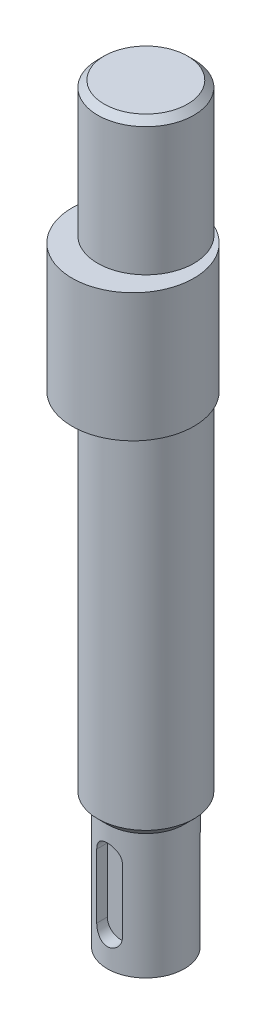
ISO-10303-21;
HEADER;
FILE_DESCRIPTION(('STEP AP214'),'2;1');
FILE_NAME('part.step','',(''),(''),'','','');
FILE_SCHEMA(('AUTOMOTIVE_DESIGN { 1 0 10303 214 1 1 1 1 }'));
ENDSEC;
DATA;
#1=APPLICATION_CONTEXT('core data for automotive mechanical design processes');
#2=APPLICATION_PROTOCOL_DEFINITION('international standard','automotive_design',2000,#1);
#3=PRODUCT_CONTEXT('',#1,'mechanical');
#4=PRODUCT('Part','Part','',(#3));
#5=PRODUCT_RELATED_PRODUCT_CATEGORY('part','',(#4));
#6=PRODUCT_DEFINITION_FORMATION('','',#4);
#7=PRODUCT_DEFINITION_CONTEXT('part definition',#1,'design');
#8=PRODUCT_DEFINITION('design','',#6,#7);
#9=PRODUCT_DEFINITION_SHAPE('','',#8);
#10=(LENGTH_UNIT() NAMED_UNIT(*) SI_UNIT(.MILLI.,.METRE.));
#11=(NAMED_UNIT(*) PLANE_ANGLE_UNIT() SI_UNIT($,.RADIAN.));
#12=(NAMED_UNIT(*) SI_UNIT($,.STERADIAN.) SOLID_ANGLE_UNIT());
#13=UNCERTAINTY_MEASURE_WITH_UNIT(LENGTH_MEASURE(1.E-05),#10,'distance_accuracy_value','');
#14=(GEOMETRIC_REPRESENTATION_CONTEXT(3) GLOBAL_UNCERTAINTY_ASSIGNED_CONTEXT((#13)) GLOBAL_UNIT_ASSIGNED_CONTEXT((#10,
#11,#12)) REPRESENTATION_CONTEXT('',''));
#15=CARTESIAN_POINT('',(0.,0.,0.));
#16=DIRECTION('',(0.,0.,1.));
#17=DIRECTION('',(1.,0.,0.));
#18=AXIS2_PLACEMENT_3D('',#15,#16,#17);
#19=CARTESIAN_POINT('',(0.,20.,0.));
#20=DIRECTION('',(0.,-1.,0.));
#21=DIRECTION('',(0.,0.,-1.));
#22=AXIS2_PLACEMENT_3D('',#19,#20,#21);
#23=CYLINDRICAL_SURFACE('',#22,9.5);
#24=CARTESIAN_POINT('',(0.,20.,0.));
#25=DIRECTION('',(0.,1.,0.));
#26=DIRECTION('',(0.,0.,1.));
#27=AXIS2_PLACEMENT_3D('',#24,#25,#26);
#28=CIRCLE('',#27,9.5);
#29=CARTESIAN_POINT('',(0.,20.,-9.5));
#30=VERTEX_POINT('',#29);
#31=EDGE_CURVE('E137',#30,#30,#28,.T.);
#32=ORIENTED_EDGE('',*,*,#31,.F.);
#33=EDGE_LOOP('',(#32));
#34=FACE_BOUND('',#33,.T.);
#35=CARTESIAN_POINT('',(0.,0.,0.));
#36=DIRECTION('',(0.,1.,0.));
#37=DIRECTION('',(0.,0.,1.));
#38=AXIS2_PLACEMENT_3D('',#35,#36,#37);
#39=CIRCLE('',#38,9.5);
#40=CARTESIAN_POINT('',(0.,0.,-9.5));
#41=VERTEX_POINT('',#40);
#42=EDGE_CURVE('E64',#41,#41,#39,.T.);
#43=ORIENTED_EDGE('',*,*,#42,.T.);
#44=EDGE_LOOP('',(#43));
#45=FACE_BOUND('',#44,.T.);
#46=ADVANCED_FACE('F41',(#34,#45),#23,.T.);
#47=CARTESIAN_POINT('',(0.,20.,0.));
#48=DIRECTION('',(0.,1.,0.));
#49=DIRECTION('',(0.,0.,1.));
#50=AXIS2_PLACEMENT_3D('',#47,#48,#49);
#51=PLANE('',#50);
#52=ORIENTED_EDGE('',*,*,#31,.T.);
#53=CARTESIAN_POINT('',(0.,20.,-2.));
#54=DIRECTION('',(0.,1.,0.));
#55=DIRECTION('',(0.,0.,1.));
#56=AXIS2_PLACEMENT_3D('',#53,#54,#55);
#57=CIRCLE('',#56,7.5);
#58=EDGE_CURVE('E121',#30,#30,#57,.T.);
#59=ORIENTED_EDGE('',*,*,#58,.F.);
#60=EDGE_LOOP('',(#52,#59));
#61=FACE_BOUND('',#60,.T.);
#62=ADVANCED_FACE('F194',(#61),#51,.T.);
#63=CARTESIAN_POINT('',(0.,0.,0.));
#64=DIRECTION('',(0.,1.,0.));
#65=DIRECTION('',(0.,0.,1.));
#66=AXIS2_PLACEMENT_3D('',#63,#64,#65);
#67=PLANE('',#66);
#68=ORIENTED_EDGE('',*,*,#42,.F.);
#69=CARTESIAN_POINT('',(0.,0.,-2.));
#70=DIRECTION('',(0.,-1.,0.));
#71=DIRECTION('',(0.,0.,-1.));
#72=AXIS2_PLACEMENT_3D('',#69,#70,#71);
#73=CIRCLE('',#72,7.5);
#74=EDGE_CURVE('E134',#41,#41,#73,.T.);
#75=ORIENTED_EDGE('',*,*,#74,.F.);
#76=EDGE_LOOP('',(#68,#75));
#77=FACE_BOUND('',#76,.T.);
#78=ADVANCED_FACE('F201',(#77),#67,.F.);
#79=CARTESIAN_POINT('',(0.,-58.,-2.));
#80=DIRECTION('',(0.,1.,0.));
#81=DIRECTION('',(0.,0.,1.));
#82=AXIS2_PLACEMENT_3D('',#79,#80,#81);
#83=CYLINDRICAL_SURFACE('',#82,7.5);
#84=CARTESIAN_POINT('',(0.,-55.,-2.));
#85=DIRECTION('',(0.,-1.,0.));
#86=DIRECTION('',(0.,0.,-1.));
#87=AXIS2_PLACEMENT_3D('',#84,#85,#86);
#88=CIRCLE('',#87,7.5);
#89=CARTESIAN_POINT('',(0.,-55.,5.5));
#90=VERTEX_POINT('',#89);
#91=EDGE_CURVE('E50',#90,#90,#88,.F.);
#92=ORIENTED_EDGE('',*,*,#91,.T.);
#93=EDGE_LOOP('',(#92));
#94=FACE_BOUND('',#93,.T.);
#95=ORIENTED_EDGE('',*,*,#74,.T.);
#96=EDGE_LOOP('',(#95));
#97=FACE_BOUND('',#96,.T.);
#98=ADVANCED_FACE('F189',(#94,#97),#83,.T.);
#99=CARTESIAN_POINT('',(0.,-76.,-2.));
#100=DIRECTION('',(0.,1.,0.));
#101=DIRECTION('',(0.,0.,1.));
#102=AXIS2_PLACEMENT_3D('',#99,#100,#101);
#103=CYLINDRICAL_SURFACE('',#102,6.);
#104=CARTESIAN_POINT('',(0.,-56.5,-2.));
#105=DIRECTION('',(0.,1.,0.));
#106=DIRECTION('',(0.,0.,1.));
#107=AXIS2_PLACEMENT_3D('',#104,#105,#106);
#108=CIRCLE('',#107,6.);
#109=CARTESIAN_POINT('',(0.,-56.5,3.99999999999999));
#110=VERTEX_POINT('',#109);
#111=EDGE_CURVE('E11',#110,#110,#108,.F.);
#112=ORIENTED_EDGE('',*,*,#111,.T.);
#113=EDGE_LOOP('',(#112));
#114=FACE_BOUND('',#113,.T.);
#115=DIRECTION('',(0.,1.,0.));
#116=VECTOR('',#115,1.);
#117=CARTESIAN_POINT('',(-1.99999999999996,-76.,3.65685424949238));
#118=LINE('',#117,#116);
#119=CARTESIAN_POINT('',(-1.99999999999996,-71.,3.65685424949238));
#120=VERTEX_POINT('',#119);
#121=CARTESIAN_POINT('',(-1.99999999999996,-61.,3.65685424949238));
#122=VERTEX_POINT('',#121);
#123=EDGE_CURVE('E226',#120,#122,#118,.T.);
#124=ORIENTED_EDGE('',*,*,#123,.T.);
#125=CARTESIAN_POINT('',(-1.99999999999996,-61.,3.65685424949238));
#126=CARTESIAN_POINT('',(-2.00000149491836,-60.9454190063978,3.65684884188679));
#127=CARTESIAN_POINT('',(-1.99776424917475,-60.8908658756213,3.65764519886492));
#128=CARTESIAN_POINT('',(-1.98885121407278,-60.7821828318902,3.66078654578444));
#129=CARTESIAN_POINT('',(-1.98217662286702,-60.7280528086806,3.66313111768246));
#130=CARTESIAN_POINT('',(-1.95562135046155,-60.5672157136097,3.67238184449303));
#131=CARTESIAN_POINT('',(-1.9292084660562,-60.461638307459,3.6815058499903));
#132=CARTESIAN_POINT('',(-1.85991682366082,-60.2567496151124,3.70456149397718));
#133=CARTESIAN_POINT('',(-1.81704715197504,-60.1574349062541,3.7184904790586));
#134=CARTESIAN_POINT('',(-1.71614645792971,-59.9673203319891,3.74957574438923));
#135=CARTESIAN_POINT('',(-1.65810612564544,-59.8765257418653,3.76673400456217));
#136=CARTESIAN_POINT('',(-1.52610278704599,-59.7025595373509,3.80308960804095));
#137=CARTESIAN_POINT('',(-1.45164996064404,-59.6197702390748,3.82233755536619));
#138=CARTESIAN_POINT('',(-1.28997688598293,-59.4675879644166,3.86027697385957));
#139=CARTESIAN_POINT('',(-1.20275436910904,-59.3981973734881,3.87896834543706));
#140=CARTESIAN_POINT('',(-1.01520729191249,-59.2730409623916,3.91427765988454));
#141=CARTESIAN_POINT('',(-0.914600178716957,-59.2176780311955,3.93082875123709));
#142=CARTESIAN_POINT('',(-0.70485849993168,-59.1248154966255,3.95939217209318));
#143=CARTESIAN_POINT('',(-0.595726551186803,-59.0873104363591,3.9714058878662));
#144=CARTESIAN_POINT('',(-0.376058690956038,-59.0325285478172,3.98918142285845));
#145=CARTESIAN_POINT('',(-0.265703668920187,-59.0145934548926,3.99514617977147));
#146=CARTESIAN_POINT('',(-0.043397938911309,-58.9973674029488,4.00087216807634));
#147=CARTESIAN_POINT('',(0.0685523824908216,-58.9980720014605,4.00063487762605));
#148=CARTESIAN_POINT('',(0.286207690558819,-59.0176885662133,3.99412077270532));
#149=CARTESIAN_POINT('',(0.391985405251105,-59.0358852759189,3.98808121982527));
#150=CARTESIAN_POINT('',(0.598888128753344,-59.0887863973482,3.97093921001647));
#151=CARTESIAN_POINT('',(0.700012879232962,-59.1234917244125,3.95983647235463));
#152=CARTESIAN_POINT('',(0.89630524606196,-59.2088427392013,3.93351336542608));
#153=CARTESIAN_POINT('',(0.991377011308018,-59.2596920902447,3.91824075676624));
#154=CARTESIAN_POINT('',(1.17184917819501,-59.3757199027814,3.88516775360087));
#155=CARTESIAN_POINT('',(1.2572469394294,-59.440902262093,3.86736667195187));
#156=CARTESIAN_POINT('',(1.42019467942245,-59.5873420999937,3.83012543885479));
#157=CARTESIAN_POINT('',(1.49718722322543,-59.6692110872194,3.81064757359827));
#158=CARTESIAN_POINT('',(1.6365440496408,-59.8448829794323,3.77294980945701));
#159=CARTESIAN_POINT('',(1.69890360636766,-59.9386897248065,3.75473031831507));
#160=CARTESIAN_POINT('',(1.8080066511856,-60.1373603567066,3.72140062752635));
#161=CARTESIAN_POINT('',(1.85450601901539,-60.2423670298659,3.70634029896468));
#162=CARTESIAN_POINT('',(1.92892046140227,-60.4592939551799,3.68162194124077));
#163=CARTESIAN_POINT('',(1.95686487211076,-60.5712029867443,3.67195538817986));
#164=CARTESIAN_POINT('',(1.9833163125617,-60.736837273496,3.6627308418944));
#165=CARTESIAN_POINT('',(1.98957012251026,-60.7892827797085,3.66053335389203));
#166=CARTESIAN_POINT('',(1.99790923214242,-60.8944761567996,3.65759407142796));
#167=CARTESIAN_POINT('',(1.99999991078998,-60.9472235490888,3.65685039859055));
#168=CARTESIAN_POINT('',(2.00000000000004,-61.,3.65685424949238));
#169=B_SPLINE_CURVE_WITH_KNOTS('',3,(#125,#126,#127,#128,#129,#130,#131,#132,#133,#134,#135,
#136,#137,#138,#139,#140,#141,#142,#143,#144,#145,#146,#147,#148,#149,#150,#151,#152,#153,#154,
#155,#156,#157,#158,#159,#160,#161,#162,#163,#164,#165,#166,#167,#168),.UNSPECIFIED.,.F.,.F.,(4,
2,2,2,2,2,2,2,2,2,2,2,2,2,2,2,2,2,2,2,2,4),(0.,0.163636969470867,0.327229772338926,
0.653162396790755,0.978915321932482,1.30486862627064,1.64233009925356,1.97985159727496,
2.32618265866203,2.67240782242255,3.00658941454807,3.34069136061285,3.66168836931471,
3.98270317816496,4.30794037651936,4.63326613177538,4.973881081161,5.31460588498485,
5.66036059856081,6.00556734973679,6.16399790665503,6.32222363058114),.UNSPECIFIED.);
#170=CARTESIAN_POINT('',(2.00000000000004,-61.,3.65685424949238));
#171=VERTEX_POINT('',#170);
#172=EDGE_CURVE('E140',#122,#171,#169,.T.);
#173=ORIENTED_EDGE('',*,*,#172,.T.);
#174=DIRECTION('',(0.,1.,0.));
#175=VECTOR('',#174,1.);
#176=CARTESIAN_POINT('',(2.00000000000004,-76.,3.65685424949238));
#177=LINE('',#176,#175);
#178=CARTESIAN_POINT('',(2.00000000000004,-71.,3.65685424949238));
#179=VERTEX_POINT('',#178);
#180=EDGE_CURVE('E230',#171,#179,#177,.F.);
#181=ORIENTED_EDGE('',*,*,#180,.T.);
#182=CARTESIAN_POINT('',(2.00000000000004,-71.,3.65685424949238));
#183=CARTESIAN_POINT('',(2.00000149491843,-71.0545809936022,3.65684884188677));
#184=CARTESIAN_POINT('',(1.99776424917481,-71.1091341243786,3.65764519886489));
#185=CARTESIAN_POINT('',(1.98885121407283,-71.2178171681098,3.6607865457844));
#186=CARTESIAN_POINT('',(1.98217662286708,-71.2719471913194,3.66313111768242));
#187=CARTESIAN_POINT('',(1.95562135046161,-71.4327842863903,3.67238184449301));
#188=CARTESIAN_POINT('',(1.92920846605626,-71.5383616925409,3.68150584999031));
#189=CARTESIAN_POINT('',(1.85991682366089,-71.7432503848875,3.70456149397718));
#190=CARTESIAN_POINT('',(1.8170471519751,-71.8425650937458,3.71849047905857));
#191=CARTESIAN_POINT('',(1.71614645792977,-72.0326796680109,3.7495757443892));
#192=CARTESIAN_POINT('',(1.6581061256455,-72.1234742581347,3.76673400456216));
#193=CARTESIAN_POINT('',(1.52610278704606,-72.2974404626491,3.80308960804095));
#194=CARTESIAN_POINT('',(1.4516499606441,-72.3802297609252,3.82233755536617));
#195=CARTESIAN_POINT('',(1.28997688598299,-72.5324120355834,3.86027697385955));
#196=CARTESIAN_POINT('',(1.2027543691091,-72.6018026265119,3.87896834543706));
#197=CARTESIAN_POINT('',(1.01520729191256,-72.7269590376084,3.91427765988455));
#198=CARTESIAN_POINT('',(0.914600178717026,-72.7823219688045,3.93082875123708));
#199=CARTESIAN_POINT('',(0.70485849993175,-72.8751845033745,3.95939217209316));
#200=CARTESIAN_POINT('',(0.595726551186871,-72.9126895636409,3.97140588786619));
#201=CARTESIAN_POINT('',(0.376058690956105,-72.9674714521827,3.98918142285846));
#202=CARTESIAN_POINT('',(0.265703668920256,-72.9854065451074,3.99514617977147));
#203=CARTESIAN_POINT('',(0.0433979389113809,-73.0026325970512,4.00087216807634));
#204=CARTESIAN_POINT('',(-0.068552382490749,-73.0019279985395,4.00063487762605));
#205=CARTESIAN_POINT('',(-0.286207690558748,-72.9823114337867,3.99412077270532));
#206=CARTESIAN_POINT('',(-0.391985405251036,-72.9641147240811,3.98808121982528));
#207=CARTESIAN_POINT('',(-0.598888128753276,-72.9112136026518,3.97093921001648));
#208=CARTESIAN_POINT('',(-0.700012879232893,-72.8765082755875,3.95983647235462));
#209=CARTESIAN_POINT('',(-0.89630524606189,-72.7911572607987,3.93351336542609));
#210=CARTESIAN_POINT('',(-0.991377011307949,-72.7403079097553,3.91824075676626));
#211=CARTESIAN_POINT('',(-1.17184917819494,-72.6242800972186,3.88516775360089));
#212=CARTESIAN_POINT('',(-1.25724693942934,-72.559097737907,3.86736667195187));
#213=CARTESIAN_POINT('',(-1.42019467942239,-72.4126579000063,3.83012543885479));
#214=CARTESIAN_POINT('',(-1.49718722322536,-72.3307889127806,3.8106475735983));
#215=CARTESIAN_POINT('',(-1.63654404964073,-72.1551170205677,3.77294980945704));
#216=CARTESIAN_POINT('',(-1.69890360636759,-72.0613102751935,3.75473031831507));
#217=CARTESIAN_POINT('',(-1.80800665118554,-71.8626396432934,3.72140062752635));
#218=CARTESIAN_POINT('',(-1.85450601901534,-71.7576329701341,3.70634029896471));
#219=CARTESIAN_POINT('',(-1.9289204614022,-71.5407060448201,3.6816219412408));
#220=CARTESIAN_POINT('',(-1.95686487211067,-71.4287970132557,3.67195538817985));
#221=CARTESIAN_POINT('',(-1.98331631256162,-71.263162726504,3.6627308418944));
#222=CARTESIAN_POINT('',(-1.9895701225102,-71.2107172202915,3.66053335389205));
#223=CARTESIAN_POINT('',(-1.99790923214237,-71.1055238432004,3.657594071428));
#224=CARTESIAN_POINT('',(-1.99999991078993,-71.0527764509112,3.65685039859058));
#225=CARTESIAN_POINT('',(-1.99999999999996,-71.,3.65685424949238));
#226=B_SPLINE_CURVE_WITH_KNOTS('',3,(#182,#183,#184,#185,#186,#187,#188,#189,#190,#191,#192,
#193,#194,#195,#196,#197,#198,#199,#200,#201,#202,#203,#204,#205,#206,#207,#208,#209,#210,#211,
#212,#213,#214,#215,#216,#217,#218,#219,#220,#221,#222,#223,#224,#225),.UNSPECIFIED.,.F.,.F.,(4,
2,2,2,2,2,2,2,2,2,2,2,2,2,2,2,2,2,2,2,2,4),(0.,0.163636969470853,0.327229772338919,
0.653162396790743,0.978915321932481,1.30486862627062,1.64233009925356,1.97985159727495,
2.32618265866202,2.67240782242254,3.00658941454805,3.34069136061284,3.66168836931469,
3.98270317816495,4.30794037651935,4.63326613177537,4.97388108116099,5.31460588498485,
5.66036059856081,6.00556734973678,6.16399790665503,6.32222363058113),.UNSPECIFIED.);
#227=EDGE_CURVE('E57',#179,#120,#226,.T.);
#228=ORIENTED_EDGE('',*,*,#227,.T.);
#229=EDGE_LOOP('',(#124,#173,#181,#228));
#230=FACE_BOUND('',#229,.T.);
#231=CARTESIAN_POINT('',(0.,-76.,-2.));
#232=DIRECTION('',(0.,-1.,0.));
#233=DIRECTION('',(0.,0.,-1.));
#234=AXIS2_PLACEMENT_3D('',#231,#232,#233);
#235=CIRCLE('',#234,6.);
#236=CARTESIAN_POINT('',(0.,-76.,-8.));
#237=VERTEX_POINT('',#236);
#238=EDGE_CURVE('E131',#237,#237,#235,.T.);
#239=ORIENTED_EDGE('',*,*,#238,.F.);
#240=EDGE_LOOP('',(#239));
#241=FACE_BOUND('',#240,.T.);
#242=ADVANCED_FACE('F156',(#114,#230,#241),#103,.T.);
#243=CARTESIAN_POINT('',(0.,-76.,-2.));
#244=DIRECTION('',(0.,-1.,0.));
#245=DIRECTION('',(0.,0.,-1.));
#246=AXIS2_PLACEMENT_3D('',#243,#244,#245);
#247=PLANE('',#246);
#248=CARTESIAN_POINT('',(0.,-76.,-2.));
#249=DIRECTION('',(0.,-1.,0.));
#250=DIRECTION('',(0.,0.,-1.));
#251=AXIS2_PLACEMENT_3D('',#248,#249,#250);
#252=CIRCLE('',#251,2.5);
#253=CARTESIAN_POINT('',(0.,-76.,-4.5));
#254=VERTEX_POINT('',#253);
#255=EDGE_CURVE('E102',#254,#254,#252,.T.);
#256=ORIENTED_EDGE('',*,*,#255,.F.);
#257=EDGE_LOOP('',(#256));
#258=FACE_BOUND('',#257,.T.);
#259=ORIENTED_EDGE('',*,*,#238,.T.);
#260=EDGE_LOOP('',(#259));
#261=FACE_BOUND('',#260,.T.);
#262=ADVANCED_FACE('F181',(#258,#261),#247,.T.);
#263=CARTESIAN_POINT('',(0.,41.,-2.));
#264=DIRECTION('',(0.,-1.,0.));
#265=DIRECTION('',(0.,0.,-1.));
#266=AXIS2_PLACEMENT_3D('',#263,#264,#265);
#267=CYLINDRICAL_SURFACE('',#266,7.5);
#268=CARTESIAN_POINT('',(0.,40.,-2.));
#269=DIRECTION('',(0.,1.,0.));
#270=DIRECTION('',(0.,0.,1.));
#271=AXIS2_PLACEMENT_3D('',#268,#269,#270);
#272=CIRCLE('',#271,7.5);
#273=CARTESIAN_POINT('',(0.,40.,5.5));
#274=VERTEX_POINT('',#273);
#275=EDGE_CURVE('E222',#274,#274,#272,.F.);
#276=ORIENTED_EDGE('',*,*,#275,.T.);
#277=EDGE_LOOP('',(#276));
#278=FACE_BOUND('',#277,.T.);
#279=ORIENTED_EDGE('',*,*,#58,.T.);
#280=EDGE_LOOP('',(#279));
#281=FACE_BOUND('',#280,.T.);
#282=ADVANCED_FACE('F178',(#278,#281),#267,.T.);
#283=CARTESIAN_POINT('',(0.,41.,-2.));
#284=DIRECTION('',(0.,1.,0.));
#285=DIRECTION('',(0.,0.,1.));
#286=AXIS2_PLACEMENT_3D('',#283,#284,#285);
#287=PLANE('',#286);
#288=CARTESIAN_POINT('',(0.,41.,-2.));
#289=DIRECTION('',(0.,1.,0.));
#290=DIRECTION('',(0.,0.,1.));
#291=AXIS2_PLACEMENT_3D('',#288,#289,#290);
#292=CIRCLE('',#291,6.5);
#293=CARTESIAN_POINT('',(0.,41.,4.50000000000001));
#294=VERTEX_POINT('',#293);
#295=EDGE_CURVE('E225',#294,#294,#292,.T.);
#296=ORIENTED_EDGE('',*,*,#295,.T.);
#297=EDGE_LOOP('',(#296));
#298=FACE_BOUND('',#297,.T.);
#299=ADVANCED_FACE('F175',(#298),#287,.T.);
#300=CARTESIAN_POINT('',(0.,-71.,2.));
#301=DIRECTION('',(0.,0.,1.));
#302=DIRECTION('',(1.,0.,0.));
#303=AXIS2_PLACEMENT_3D('',#300,#301,#302);
#304=CYLINDRICAL_SURFACE('',#303,2.);
#305=DIRECTION('',(0.,0.,1.));
#306=VECTOR('',#305,1.);
#307=CARTESIAN_POINT('',(2.00000000000002,-71.,2.));
#308=LINE('',#307,#306);
#309=CARTESIAN_POINT('',(2.00000000000002,-71.,2.));
#310=VERTEX_POINT('',#309);
#311=EDGE_CURVE('E118',#310,#179,#308,.T.);
#312=ORIENTED_EDGE('',*,*,#311,.F.);
#313=CARTESIAN_POINT('',(0.,-71.,2.));
#314=DIRECTION('',(0.,0.,1.));
#315=DIRECTION('',(1.,0.,0.));
#316=AXIS2_PLACEMENT_3D('',#313,#314,#315);
#317=CIRCLE('',#316,2.);
#318=CARTESIAN_POINT('',(-1.99999999999998,-71.,2.));
#319=VERTEX_POINT('',#318);
#320=EDGE_CURVE('E101',#319,#310,#317,.T.);
#321=ORIENTED_EDGE('',*,*,#320,.F.);
#322=DIRECTION('',(0.,0.,1.));
#323=VECTOR('',#322,1.);
#324=CARTESIAN_POINT('',(-1.99999999999998,-71.,2.));
#325=LINE('',#324,#323);
#326=EDGE_CURVE('E119',#319,#120,#325,.T.);
#327=ORIENTED_EDGE('',*,*,#326,.T.);
#328=ORIENTED_EDGE('',*,*,#227,.F.);
#329=EDGE_LOOP('',(#312,#321,#327,#328));
#330=FACE_BOUND('',#329,.T.);
#331=ADVANCED_FACE('F171',(#330),#304,.F.);
#332=CARTESIAN_POINT('',(-1.99999999999998,-71.,2.));
#333=DIRECTION('',(-1.,0.,0.));
#334=DIRECTION('',(0.,0.,1.));
#335=AXIS2_PLACEMENT_3D('',#332,#333,#334);
#336=PLANE('',#335);
#337=ORIENTED_EDGE('',*,*,#326,.F.);
#338=DIRECTION('',(0.,-1.,0.));
#339=VECTOR('',#338,1.);
#340=CARTESIAN_POINT('',(-1.99999999999998,-71.,2.));
#341=LINE('',#340,#339);
#342=CARTESIAN_POINT('',(-1.99999999999998,-61.,2.));
#343=VERTEX_POINT('',#342);
#344=EDGE_CURVE('E115',#343,#319,#341,.T.);
#345=ORIENTED_EDGE('',*,*,#344,.F.);
#346=DIRECTION('',(0.,0.,1.));
#347=VECTOR('',#346,1.);
#348=CARTESIAN_POINT('',(-1.99999999999998,-61.,2.));
#349=LINE('',#348,#347);
#350=EDGE_CURVE('E122',#343,#122,#349,.T.);
#351=ORIENTED_EDGE('',*,*,#350,.T.);
#352=ORIENTED_EDGE('',*,*,#123,.F.);
#353=EDGE_LOOP('',(#337,#345,#351,#352));
#354=FACE_BOUND('',#353,.T.);
#355=ADVANCED_FACE('F166',(#354),#336,.F.);
#356=CARTESIAN_POINT('',(0.,-61.,2.));
#357=DIRECTION('',(0.,0.,1.));
#358=DIRECTION('',(1.,0.,0.));
#359=AXIS2_PLACEMENT_3D('',#356,#357,#358);
#360=CYLINDRICAL_SURFACE('',#359,2.);
#361=ORIENTED_EDGE('',*,*,#350,.F.);
#362=CARTESIAN_POINT('',(0.,-61.,2.));
#363=DIRECTION('',(0.,0.,1.));
#364=DIRECTION('',(1.,0.,0.));
#365=AXIS2_PLACEMENT_3D('',#362,#363,#364);
#366=CIRCLE('',#365,2.);
#367=CARTESIAN_POINT('',(2.00000000000002,-61.,2.));
#368=VERTEX_POINT('',#367);
#369=EDGE_CURVE('E112',#368,#343,#366,.T.);
#370=ORIENTED_EDGE('',*,*,#369,.F.);
#371=DIRECTION('',(0.,0.,1.));
#372=VECTOR('',#371,1.);
#373=CARTESIAN_POINT('',(2.00000000000002,-61.,2.));
#374=LINE('',#373,#372);
#375=EDGE_CURVE('E125',#368,#171,#374,.T.);
#376=ORIENTED_EDGE('',*,*,#375,.T.);
#377=ORIENTED_EDGE('',*,*,#172,.F.);
#378=EDGE_LOOP('',(#361,#370,#376,#377));
#379=FACE_BOUND('',#378,.T.);
#380=ADVANCED_FACE('F160',(#379),#360,.F.);
#381=CARTESIAN_POINT('',(2.00000000000002,-71.,2.));
#382=DIRECTION('',(1.,0.,0.));
#383=DIRECTION('',(0.,0.,-1.));
#384=AXIS2_PLACEMENT_3D('',#381,#382,#383);
#385=PLANE('',#384);
#386=ORIENTED_EDGE('',*,*,#375,.F.);
#387=DIRECTION('',(0.,1.,0.));
#388=VECTOR('',#387,1.);
#389=CARTESIAN_POINT('',(2.00000000000002,-71.,2.));
#390=LINE('',#389,#388);
#391=EDGE_CURVE('E105',#310,#368,#390,.T.);
#392=ORIENTED_EDGE('',*,*,#391,.F.);
#393=ORIENTED_EDGE('',*,*,#311,.T.);
#394=ORIENTED_EDGE('',*,*,#180,.F.);
#395=EDGE_LOOP('',(#386,#392,#393,#394));
#396=FACE_BOUND('',#395,.T.);
#397=ADVANCED_FACE('F165',(#396),#385,.F.);
#398=CARTESIAN_POINT('',(0.,-71.,2.));
#399=DIRECTION('',(0.,0.,1.));
#400=DIRECTION('',(1.,0.,0.));
#401=AXIS2_PLACEMENT_3D('',#398,#399,#400);
#402=PLANE('',#401);
#403=ORIENTED_EDGE('',*,*,#320,.T.);
#404=ORIENTED_EDGE('',*,*,#391,.T.);
#405=ORIENTED_EDGE('',*,*,#369,.T.);
#406=ORIENTED_EDGE('',*,*,#344,.T.);
#407=EDGE_LOOP('',(#403,#404,#405,#406));
#408=FACE_BOUND('',#407,.T.);
#409=ADVANCED_FACE('F95',(#408),#402,.T.);
#410=CARTESIAN_POINT('',(0.,-66.,-2.));
#411=DIRECTION('',(0.,-1.,0.));
#412=DIRECTION('',(0.,0.,-1.));
#413=AXIS2_PLACEMENT_3D('',#410,#411,#412);
#414=CONICAL_SURFACE('',#413,2.5,1.02974425867665);
#415=CARTESIAN_POINT('',(0.,-64.4978484524311,-2.));
#416=VERTEX_POINT('',#415);
#417=VERTEX_LOOP('',#416);
#418=FACE_BOUND('',#417,.T.);
#419=CARTESIAN_POINT('',(0.,-66.,-2.));
#420=DIRECTION('',(0.,-1.,0.));
#421=DIRECTION('',(0.,0.,-1.));
#422=AXIS2_PLACEMENT_3D('',#419,#420,#421);
#423=CIRCLE('',#422,2.5);
#424=CARTESIAN_POINT('',(0.,-66.,-4.5));
#425=VERTEX_POINT('',#424);
#426=EDGE_CURVE('E99',#425,#425,#423,.T.);
#427=ORIENTED_EDGE('',*,*,#426,.T.);
#428=EDGE_LOOP('',(#427));
#429=FACE_BOUND('',#428,.T.);
#430=ADVANCED_FACE('F91',(#418,#429),#414,.F.);
#431=CARTESIAN_POINT('',(0.,-76.,-2.));
#432=DIRECTION('',(0.,-1.,0.));
#433=DIRECTION('',(0.,0.,-1.));
#434=AXIS2_PLACEMENT_3D('',#431,#432,#433);
#435=CYLINDRICAL_SURFACE('',#434,2.5);
#436=ORIENTED_EDGE('',*,*,#426,.F.);
#437=EDGE_LOOP('',(#436));
#438=FACE_BOUND('',#437,.T.);
#439=ORIENTED_EDGE('',*,*,#255,.T.);
#440=EDGE_LOOP('',(#439));
#441=FACE_BOUND('',#440,.T.);
#442=ADVANCED_FACE('F94',(#438,#441),#435,.F.);
#443=CARTESIAN_POINT('',(0.,41.,-2.));
#444=DIRECTION('',(0.,-1.,0.));
#445=DIRECTION('',(0.,0.,-1.));
#446=AXIS2_PLACEMENT_3D('',#443,#444,#445);
#447=CONICAL_SURFACE('',#446,6.5,0.785398163397449);
#448=ORIENTED_EDGE('',*,*,#275,.F.);
#449=EDGE_LOOP('',(#448));
#450=FACE_BOUND('',#449,.T.);
#451=ORIENTED_EDGE('',*,*,#295,.F.);
#452=EDGE_LOOP('',(#451));
#453=FACE_BOUND('',#452,.T.);
#454=ADVANCED_FACE('F207',(#450,#453),#447,.T.);
#455=CARTESIAN_POINT('',(0.,-58.,-2.));
#456=DIRECTION('',(0.,1.,0.));
#457=DIRECTION('',(0.,0.,1.));
#458=AXIS2_PLACEMENT_3D('',#455,#456,#457);
#459=CONICAL_SURFACE('',#458,4.49999999999995,0.785398163397453);
#460=CARTESIAN_POINT('',(0.,-55.,5.5));
#461=CARTESIAN_POINT('',(0.,-55.015625,5.484375));
#462=CARTESIAN_POINT('',(0.,-55.03125,5.46875));
#463=CARTESIAN_POINT('',(0.,-55.0625,5.4375));
#464=CARTESIAN_POINT('',(0.,-55.078125,5.421875));
#465=CARTESIAN_POINT('',(0.,-55.109375,5.390625));
#466=CARTESIAN_POINT('',(0.,-55.125,5.375));
#467=CARTESIAN_POINT('',(0.,-55.15625,5.34375));
#468=CARTESIAN_POINT('',(0.,-55.171875,5.328125));
#469=CARTESIAN_POINT('',(0.,-55.203125,5.296875));
#470=CARTESIAN_POINT('',(0.,-55.21875,5.28125));
#471=CARTESIAN_POINT('',(0.,-55.25,5.25));
#472=CARTESIAN_POINT('',(0.,-55.265625,5.234375));
#473=CARTESIAN_POINT('',(0.,-55.296875,5.203125));
#474=CARTESIAN_POINT('',(0.,-55.3125,5.1875));
#475=CARTESIAN_POINT('',(0.,-55.34375,5.15625));
#476=CARTESIAN_POINT('',(0.,-55.359375,5.140625));
#477=CARTESIAN_POINT('',(0.,-55.390625,5.10937499999999));
#478=CARTESIAN_POINT('',(0.,-55.40625,5.09375));
#479=CARTESIAN_POINT('',(0.,-55.4375,5.0625));
#480=CARTESIAN_POINT('',(0.,-55.453125,5.046875));
#481=CARTESIAN_POINT('',(0.,-55.484375,5.015625));
#482=CARTESIAN_POINT('',(0.,-55.5,5.));
#483=CARTESIAN_POINT('',(0.,-55.53125,4.96874999999999));
#484=CARTESIAN_POINT('',(0.,-55.546875,4.95312499999999));
#485=CARTESIAN_POINT('',(0.,-55.578125,4.92187499999999));
#486=CARTESIAN_POINT('',(0.,-55.59375,4.90624999999999));
#487=CARTESIAN_POINT('',(0.,-55.625,4.87499999999999));
#488=CARTESIAN_POINT('',(0.,-55.640625,4.85937499999999));
#489=CARTESIAN_POINT('',(0.,-55.671875,4.82812499999999));
#490=CARTESIAN_POINT('',(0.,-55.6875,4.81249999999999));
#491=CARTESIAN_POINT('',(0.,-55.71875,4.78124999999999));
#492=CARTESIAN_POINT('',(0.,-55.734375,4.76562499999999));
#493=CARTESIAN_POINT('',(0.,-55.765625,4.73437499999999));
#494=CARTESIAN_POINT('',(0.,-55.78125,4.71874999999999));
#495=CARTESIAN_POINT('',(0.,-55.8125,4.68749999999999));
#496=CARTESIAN_POINT('',(0.,-55.828125,4.67187499999999));
#497=CARTESIAN_POINT('',(0.,-55.859375,4.64062499999999));
#498=CARTESIAN_POINT('',(0.,-55.875,4.62499999999999));
#499=CARTESIAN_POINT('',(0.,-55.90625,4.59374999999999));
#500=CARTESIAN_POINT('',(0.,-55.921875,4.57812499999999));
#501=CARTESIAN_POINT('',(0.,-55.953125,4.54687499999999));
#502=CARTESIAN_POINT('',(0.,-55.96875,4.53124999999999));
#503=CARTESIAN_POINT('',(0.,-56.,4.49999999999999));
#504=CARTESIAN_POINT('',(0.,-56.015625,4.48437499999999));
#505=CARTESIAN_POINT('',(0.,-56.046875,4.45312499999999));
#506=CARTESIAN_POINT('',(0.,-56.0625,4.43749999999999));
#507=CARTESIAN_POINT('',(0.,-56.09375,4.40624999999999));
#508=CARTESIAN_POINT('',(0.,-56.109375,4.39062499999999));
#509=CARTESIAN_POINT('',(0.,-56.140625,4.35937499999999));
#510=CARTESIAN_POINT('',(0.,-56.15625,4.34374999999999));
#511=CARTESIAN_POINT('',(0.,-56.1875,4.31249999999999));
#512=CARTESIAN_POINT('',(0.,-56.203125,4.29687499999999));
#513=CARTESIAN_POINT('',(0.,-56.234375,4.26562499999999));
#514=CARTESIAN_POINT('',(0.,-56.25,4.24999999999999));
#515=CARTESIAN_POINT('',(0.,-56.28125,4.21874999999999));
#516=CARTESIAN_POINT('',(0.,-56.296875,4.20312499999999));
#517=CARTESIAN_POINT('',(0.,-56.328125,4.17187499999999));
#518=CARTESIAN_POINT('',(0.,-56.34375,4.15624999999999));
#519=CARTESIAN_POINT('',(0.,-56.375,4.12499999999999));
#520=CARTESIAN_POINT('',(0.,-56.390625,4.10937499999999));
#521=CARTESIAN_POINT('',(0.,-56.421875,4.07812499999999));
#522=CARTESIAN_POINT('',(0.,-56.4375,4.06249999999999));
#523=CARTESIAN_POINT('',(0.,-56.46875,4.03124999999999));
#524=CARTESIAN_POINT('',(0.,-56.484375,4.01562499999999));
#525=CARTESIAN_POINT('',(0.,-56.5,3.99999999999999));
#526=B_SPLINE_CURVE_WITH_KNOTS('',3,(#460,#461,#462,#463,#464,#465,#466,#467,#468,#469,#470,
#471,#472,#473,#474,#475,#476,#477,#478,#479,#480,#481,#482,#483,#484,#485,#486,#487,#488,#489,
#490,#491,#492,#493,#494,#495,#496,#497,#498,#499,#500,#501,#502,#503,#504,#505,#506,#507,#508,
#509,#510,#511,#512,#513,#514,#515,#516,#517,#518,#519,#520,#521,#522,#523,#524,#525),
.UNSPECIFIED.,.F.,.F.,(4,2,2,2,2,2,2,2,2,2,2,2,2,2,2,2,2,2,2,2,2,2,2,2,2,2,2,2,2,2,2,2,4),(0.,
0.0662912607362407,0.132582521472481,0.198873782208721,0.265165042944956,0.331456303681197,
0.397747564417437,0.464038825153678,0.530330085889913,0.596621346626153,0.662912607362393,
0.729203868098628,0.795495128834869,0.861786389571109,0.92807765030735,0.994368911043585,
1.06066017177983,1.12695143251607,1.1932426932523,1.25953395398854,1.32582521472478,
1.39211647546102,1.45840773619726,1.5246989969335,1.59099025766974,1.65728151840597,
1.72357277914221,1.78986403987845,1.85615530061469,1.92244656135093,1.98873782208717,
2.05502908282341,2.12132034355965),.UNSPECIFIED.);
#527=EDGE_CURVE('BSEAM44',#90,#110,#526,.T.);
#528=ORIENTED_EDGE('',*,*,#91,.F.);
#529=ORIENTED_EDGE('',*,*,#111,.F.);
#530=ORIENTED_EDGE('',*,*,#527,.T.);
#531=ORIENTED_EDGE('',*,*,#527,.F.);
#532=EDGE_LOOP('',(#528,#530,#529,#531));
#533=FACE_BOUND('',#532,.T.);
#534=ADVANCED_FACE('F44',(#533),#459,.T.);
#535=CLOSED_SHELL('',(#46,#62,#78,#98,#242,#262,#282,#299,#331,#355,#380,#397,#409,#430,#442,
#454,#534));
#536=MANIFOLD_SOLID_BREP('B2',#535);
#537=ADVANCED_BREP_SHAPE_REPRESENTATION('',(#18,#536),#14);
#538=SHAPE_DEFINITION_REPRESENTATION(#9,#537);
ENDSEC;
END-ISO-10303-21;
